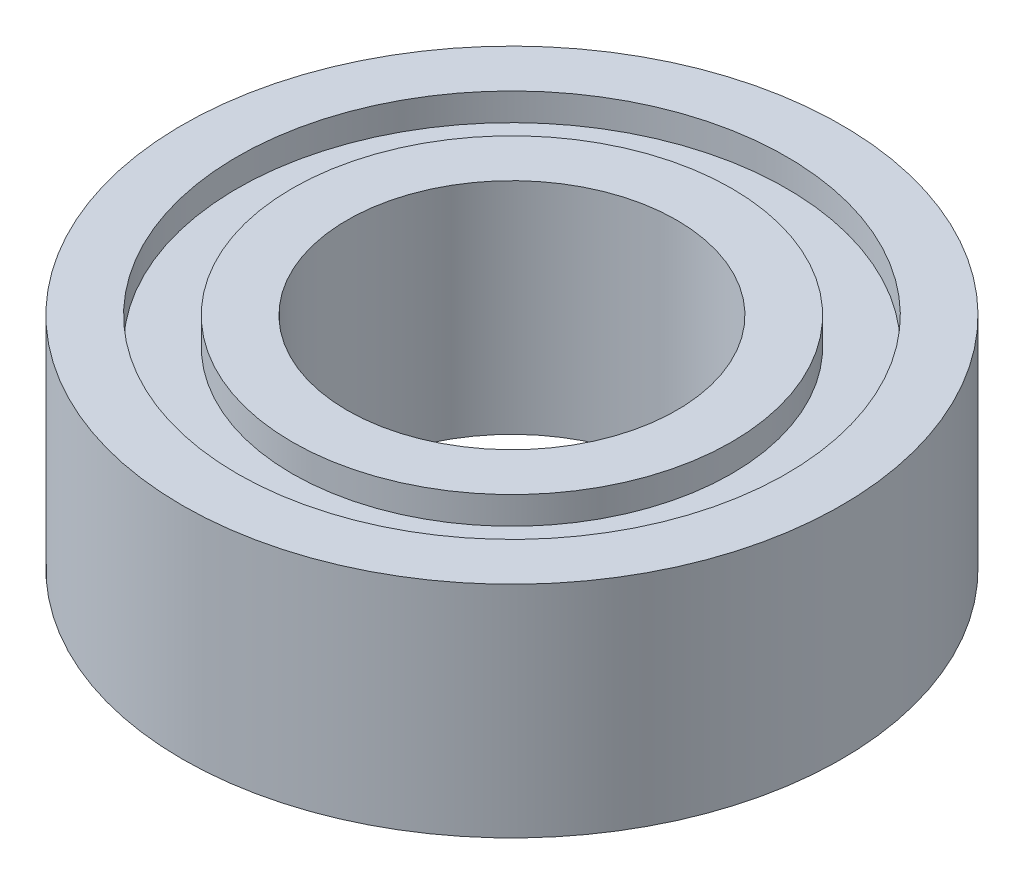
ISO-10303-21;
HEADER;
FILE_DESCRIPTION(('STEP AP214'),'2;1');
FILE_NAME('part.step','',(''),(''),'','','');
FILE_SCHEMA(('AUTOMOTIVE_DESIGN { 1 0 10303 214 1 1 1 1 }'));
ENDSEC;
DATA;
#1=APPLICATION_CONTEXT('core data for automotive mechanical design processes');
#2=APPLICATION_PROTOCOL_DEFINITION('international standard','automotive_design',2000,#1);
#3=PRODUCT_CONTEXT('',#1,'mechanical');
#4=PRODUCT('Part','Part','',(#3));
#5=PRODUCT_RELATED_PRODUCT_CATEGORY('part','',(#4));
#6=PRODUCT_DEFINITION_FORMATION('','',#4);
#7=PRODUCT_DEFINITION_CONTEXT('part definition',#1,'design');
#8=PRODUCT_DEFINITION('design','',#6,#7);
#9=PRODUCT_DEFINITION_SHAPE('','',#8);
#10=(LENGTH_UNIT() NAMED_UNIT(*) SI_UNIT(.MILLI.,.METRE.));
#11=(NAMED_UNIT(*) PLANE_ANGLE_UNIT() SI_UNIT($,.RADIAN.));
#12=(NAMED_UNIT(*) SI_UNIT($,.STERADIAN.) SOLID_ANGLE_UNIT());
#13=UNCERTAINTY_MEASURE_WITH_UNIT(LENGTH_MEASURE(1.E-05),#10,'distance_accuracy_value','');
#14=(GEOMETRIC_REPRESENTATION_CONTEXT(3) GLOBAL_UNCERTAINTY_ASSIGNED_CONTEXT((#13)) GLOBAL_UNIT_ASSIGNED_CONTEXT((#10,
#11,#12)) REPRESENTATION_CONTEXT('',''));
#15=CARTESIAN_POINT('',(0.,0.,0.));
#16=DIRECTION('',(0.,0.,1.));
#17=DIRECTION('',(1.,0.,0.));
#18=AXIS2_PLACEMENT_3D('',#15,#16,#17);
#19=CARTESIAN_POINT('',(0.,-2.,0.));
#20=DIRECTION('',(0.,1.,0.));
#21=DIRECTION('',(0.,0.,1.));
#22=AXIS2_PLACEMENT_3D('',#19,#20,#21);
#23=PLANE('',#22);
#24=CARTESIAN_POINT('',(0.,-2.,0.));
#25=DIRECTION('',(0.,1.,0.));
#26=DIRECTION('',(0.,0.,1.));
#27=AXIS2_PLACEMENT_3D('',#24,#25,#26);
#28=CIRCLE('',#27,3.);
#29=CARTESIAN_POINT('',(0.,-2.,3.));
#30=VERTEX_POINT('',#29);
#31=EDGE_CURVE('E58',#30,#30,#28,.T.);
#32=ORIENTED_EDGE('',*,*,#31,.T.);
#33=EDGE_LOOP('',(#32));
#34=FACE_BOUND('',#33,.T.);
#35=CARTESIAN_POINT('',(0.,-2.,0.));
#36=DIRECTION('',(0.,1.,0.));
#37=DIRECTION('',(0.,0.,1.));
#38=AXIS2_PLACEMENT_3D('',#35,#36,#37);
#39=CIRCLE('',#38,4.);
#40=CARTESIAN_POINT('',(0.,-2.,4.));
#41=VERTEX_POINT('',#40);
#42=EDGE_CURVE('E90',#41,#41,#39,.T.);
#43=ORIENTED_EDGE('',*,*,#42,.F.);
#44=EDGE_LOOP('',(#43));
#45=FACE_BOUND('',#44,.T.);
#46=ADVANCED_FACE('F43',(#34,#45),#23,.F.);
#47=CARTESIAN_POINT('',(0.,2.,0.));
#48=DIRECTION('',(0.,1.,0.));
#49=DIRECTION('',(0.,0.,1.));
#50=AXIS2_PLACEMENT_3D('',#47,#48,#49);
#51=PLANE('',#50);
#52=CARTESIAN_POINT('',(0.,2.,0.));
#53=DIRECTION('',(0.,1.,0.));
#54=DIRECTION('',(0.,0.,1.));
#55=AXIS2_PLACEMENT_3D('',#52,#53,#54);
#56=CIRCLE('',#55,3.);
#57=CARTESIAN_POINT('',(0.,2.,3.));
#58=VERTEX_POINT('',#57);
#59=EDGE_CURVE('E56',#58,#58,#56,.T.);
#60=ORIENTED_EDGE('',*,*,#59,.F.);
#61=EDGE_LOOP('',(#60));
#62=FACE_BOUND('',#61,.T.);
#63=CARTESIAN_POINT('',(0.,2.,0.));
#64=DIRECTION('',(0.,1.,0.));
#65=DIRECTION('',(0.,0.,1.));
#66=AXIS2_PLACEMENT_3D('',#63,#64,#65);
#67=CIRCLE('',#66,4.);
#68=CARTESIAN_POINT('',(0.,2.,4.));
#69=VERTEX_POINT('',#68);
#70=EDGE_CURVE('E74',#69,#69,#67,.T.);
#71=ORIENTED_EDGE('',*,*,#70,.T.);
#72=EDGE_LOOP('',(#71));
#73=FACE_BOUND('',#72,.T.);
#74=ADVANCED_FACE('F108',(#62,#73),#51,.T.);
#75=CARTESIAN_POINT('',(0.,2.,0.));
#76=DIRECTION('',(0.,1.,0.));
#77=DIRECTION('',(0.,0.,1.));
#78=AXIS2_PLACEMENT_3D('',#75,#76,#77);
#79=CIRCLE('',#78,5.);
#80=CARTESIAN_POINT('',(0.,2.,5.));
#81=VERTEX_POINT('',#80);
#82=EDGE_CURVE('E66',#81,#81,#79,.T.);
#83=ORIENTED_EDGE('',*,*,#82,.F.);
#84=EDGE_LOOP('',(#83));
#85=FACE_BOUND('',#84,.T.);
#86=CARTESIAN_POINT('',(0.,2.,0.));
#87=DIRECTION('',(0.,1.,0.));
#88=DIRECTION('',(0.,0.,1.));
#89=AXIS2_PLACEMENT_3D('',#86,#87,#88);
#90=CIRCLE('',#89,6.);
#91=CARTESIAN_POINT('',(0.,2.,6.));
#92=VERTEX_POINT('',#91);
#93=EDGE_CURVE('E10',#92,#92,#90,.T.);
#94=ORIENTED_EDGE('',*,*,#93,.T.);
#95=EDGE_LOOP('',(#94));
#96=FACE_BOUND('',#95,.T.);
#97=ADVANCED_FACE('F116',(#85,#96),#51,.T.);
#98=CARTESIAN_POINT('',(0.,-2.,0.));
#99=DIRECTION('',(0.,1.,0.));
#100=DIRECTION('',(0.,0.,1.));
#101=AXIS2_PLACEMENT_3D('',#98,#99,#100);
#102=CIRCLE('',#101,5.);
#103=CARTESIAN_POINT('',(0.,-2.,5.));
#104=VERTEX_POINT('',#103);
#105=EDGE_CURVE('E82',#104,#104,#102,.T.);
#106=ORIENTED_EDGE('',*,*,#105,.T.);
#107=EDGE_LOOP('',(#106));
#108=FACE_BOUND('',#107,.T.);
#109=CARTESIAN_POINT('',(0.,-2.,0.));
#110=DIRECTION('',(0.,1.,0.));
#111=DIRECTION('',(0.,0.,1.));
#112=AXIS2_PLACEMENT_3D('',#109,#110,#111);
#113=CIRCLE('',#112,6.);
#114=CARTESIAN_POINT('',(0.,-2.,6.));
#115=VERTEX_POINT('',#114);
#116=EDGE_CURVE('E47',#115,#115,#113,.T.);
#117=ORIENTED_EDGE('',*,*,#116,.F.);
#118=EDGE_LOOP('',(#117));
#119=FACE_BOUND('',#118,.T.);
#120=ADVANCED_FACE('F110',(#108,#119),#23,.F.);
#121=CARTESIAN_POINT('',(0.,2.,0.));
#122=DIRECTION('',(0.,-1.,0.));
#123=DIRECTION('',(0.,0.,-1.));
#124=AXIS2_PLACEMENT_3D('',#121,#122,#123);
#125=CYLINDRICAL_SURFACE('',#124,6.);
#126=ORIENTED_EDGE('',*,*,#93,.F.);
#127=EDGE_LOOP('',(#126));
#128=FACE_BOUND('',#127,.T.);
#129=ORIENTED_EDGE('',*,*,#116,.T.);
#130=EDGE_LOOP('',(#129));
#131=FACE_BOUND('',#130,.T.);
#132=ADVANCED_FACE('F45',(#128,#131),#125,.T.);
#133=CARTESIAN_POINT('',(0.,2.,0.));
#134=DIRECTION('',(0.,-1.,0.));
#135=DIRECTION('',(0.,0.,-1.));
#136=AXIS2_PLACEMENT_3D('',#133,#134,#135);
#137=CYLINDRICAL_SURFACE('',#136,3.);
#138=ORIENTED_EDGE('',*,*,#59,.T.);
#139=EDGE_LOOP('',(#138));
#140=FACE_BOUND('',#139,.T.);
#141=ORIENTED_EDGE('',*,*,#31,.F.);
#142=EDGE_LOOP('',(#141));
#143=FACE_BOUND('',#142,.T.);
#144=ADVANCED_FACE('F124',(#140,#143),#137,.F.);
#145=CARTESIAN_POINT('',(0.,1.5,0.));
#146=DIRECTION('',(0.,1.,0.));
#147=DIRECTION('',(0.,0.,1.));
#148=AXIS2_PLACEMENT_3D('',#145,#146,#147);
#149=CYLINDRICAL_SURFACE('',#148,5.);
#150=CARTESIAN_POINT('',(0.,1.5,0.));
#151=DIRECTION('',(0.,1.,0.));
#152=DIRECTION('',(0.,0.,1.));
#153=AXIS2_PLACEMENT_3D('',#150,#151,#152);
#154=CIRCLE('',#153,5.);
#155=CARTESIAN_POINT('',(0.,1.5,5.));
#156=VERTEX_POINT('',#155);
#157=EDGE_CURVE('E62',#156,#156,#154,.T.);
#158=ORIENTED_EDGE('',*,*,#157,.F.);
#159=EDGE_LOOP('',(#158));
#160=FACE_BOUND('',#159,.T.);
#161=ORIENTED_EDGE('',*,*,#82,.T.);
#162=EDGE_LOOP('',(#161));
#163=FACE_BOUND('',#162,.T.);
#164=ADVANCED_FACE('F147',(#160,#163),#149,.F.);
#165=CARTESIAN_POINT('',(0.,1.5,0.));
#166=DIRECTION('',(0.,1.,0.));
#167=DIRECTION('',(0.,0.,1.));
#168=AXIS2_PLACEMENT_3D('',#165,#166,#167);
#169=PLANE('',#168);
#170=CARTESIAN_POINT('',(0.,1.5,0.));
#171=DIRECTION('',(0.,1.,0.));
#172=DIRECTION('',(0.,0.,1.));
#173=AXIS2_PLACEMENT_3D('',#170,#171,#172);
#174=CIRCLE('',#173,4.);
#175=CARTESIAN_POINT('',(0.,1.5,4.));
#176=VERTEX_POINT('',#175);
#177=EDGE_CURVE('E70',#176,#176,#174,.T.);
#178=ORIENTED_EDGE('',*,*,#177,.F.);
#179=EDGE_LOOP('',(#178));
#180=FACE_BOUND('',#179,.T.);
#181=ORIENTED_EDGE('',*,*,#157,.T.);
#182=EDGE_LOOP('',(#181));
#183=FACE_BOUND('',#182,.T.);
#184=ADVANCED_FACE('F143',(#180,#183),#169,.T.);
#185=CARTESIAN_POINT('',(0.,1.5,0.));
#186=DIRECTION('',(0.,1.,0.));
#187=DIRECTION('',(0.,0.,1.));
#188=AXIS2_PLACEMENT_3D('',#185,#186,#187);
#189=CYLINDRICAL_SURFACE('',#188,4.);
#190=ORIENTED_EDGE('',*,*,#177,.T.);
#191=EDGE_LOOP('',(#190));
#192=FACE_BOUND('',#191,.T.);
#193=ORIENTED_EDGE('',*,*,#70,.F.);
#194=EDGE_LOOP('',(#193));
#195=FACE_BOUND('',#194,.T.);
#196=ADVANCED_FACE('F138',(#192,#195),#189,.T.);
#197=CARTESIAN_POINT('',(0.,-1.5,0.));
#198=DIRECTION('',(0.,-1.,0.));
#199=DIRECTION('',(0.,0.,1.));
#200=AXIS2_PLACEMENT_3D('',#197,#198,#199);
#201=PLANE('',#200);
#202=CARTESIAN_POINT('',(0.,-1.5,0.));
#203=DIRECTION('',(0.,1.,0.));
#204=DIRECTION('',(0.,0.,1.));
#205=AXIS2_PLACEMENT_3D('',#202,#203,#204);
#206=CIRCLE('',#205,5.);
#207=CARTESIAN_POINT('',(0.,-1.5,5.));
#208=VERTEX_POINT('',#207);
#209=EDGE_CURVE('E78',#208,#208,#206,.T.);
#210=ORIENTED_EDGE('',*,*,#209,.F.);
#211=EDGE_LOOP('',(#210));
#212=FACE_BOUND('',#211,.T.);
#213=CARTESIAN_POINT('',(0.,-1.5,0.));
#214=DIRECTION('',(0.,1.,0.));
#215=DIRECTION('',(0.,0.,1.));
#216=AXIS2_PLACEMENT_3D('',#213,#214,#215);
#217=CIRCLE('',#216,4.);
#218=CARTESIAN_POINT('',(0.,-1.5,4.));
#219=VERTEX_POINT('',#218);
#220=EDGE_CURVE('E86',#219,#219,#217,.T.);
#221=ORIENTED_EDGE('',*,*,#220,.T.);
#222=EDGE_LOOP('',(#221));
#223=FACE_BOUND('',#222,.T.);
#224=ADVANCED_FACE('F98',(#212,#223),#201,.T.);
#225=CARTESIAN_POINT('',(0.,-1.5,0.));
#226=DIRECTION('',(0.,-1.,0.));
#227=DIRECTION('',(0.,0.,-1.));
#228=AXIS2_PLACEMENT_3D('',#225,#226,#227);
#229=CYLINDRICAL_SURFACE('',#228,5.);
#230=ORIENTED_EDGE('',*,*,#209,.T.);
#231=EDGE_LOOP('',(#230));
#232=FACE_BOUND('',#231,.T.);
#233=ORIENTED_EDGE('',*,*,#105,.F.);
#234=EDGE_LOOP('',(#233));
#235=FACE_BOUND('',#234,.T.);
#236=ADVANCED_FACE('F103',(#232,#235),#229,.F.);
#237=CARTESIAN_POINT('',(0.,-1.5,0.));
#238=DIRECTION('',(0.,-1.,0.));
#239=DIRECTION('',(0.,0.,-1.));
#240=AXIS2_PLACEMENT_3D('',#237,#238,#239);
#241=CYLINDRICAL_SURFACE('',#240,4.);
#242=ORIENTED_EDGE('',*,*,#220,.F.);
#243=EDGE_LOOP('',(#242));
#244=FACE_BOUND('',#243,.T.);
#245=ORIENTED_EDGE('',*,*,#42,.T.);
#246=EDGE_LOOP('',(#245));
#247=FACE_BOUND('',#246,.T.);
#248=ADVANCED_FACE('F100',(#244,#247),#241,.T.);
#249=CLOSED_SHELL('',(#46,#74,#97,#120,#132,#144,#164,#184,#196,#224,#236,#248));
#250=MANIFOLD_SOLID_BREP('B2',#249);
#251=ADVANCED_BREP_SHAPE_REPRESENTATION('',(#18,#250),#14);
#252=SHAPE_DEFINITION_REPRESENTATION(#9,#251);
ENDSEC;
END-ISO-10303-21;
